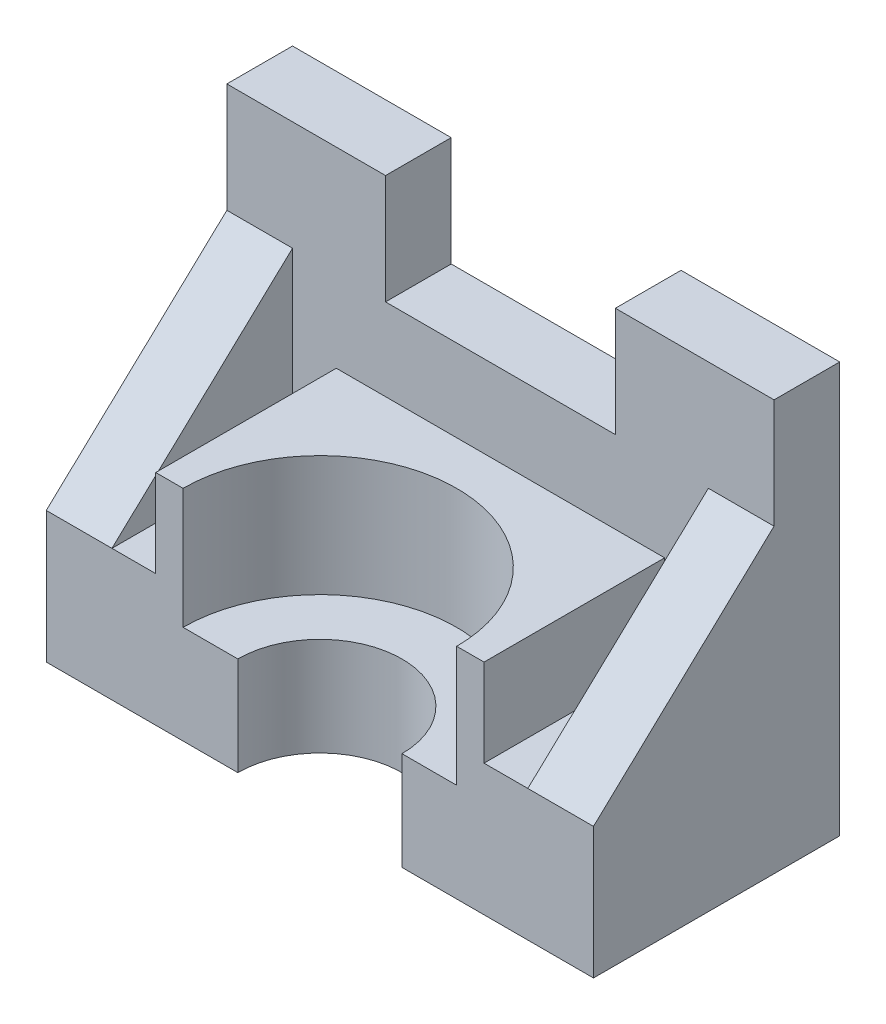
ISO-10303-21;
HEADER;
FILE_DESCRIPTION(('STEP AP214'),'2;1');
FILE_NAME('part.step','',(''),(''),'','','');
FILE_SCHEMA(('AUTOMOTIVE_DESIGN { 1 0 10303 214 1 1 1 1 }'));
ENDSEC;
DATA;
#1=APPLICATION_CONTEXT('core data for automotive mechanical design processes');
#2=APPLICATION_PROTOCOL_DEFINITION('international standard','automotive_design',2000,#1);
#3=PRODUCT_CONTEXT('',#1,'mechanical');
#4=PRODUCT('Part','Part','',(#3));
#5=PRODUCT_RELATED_PRODUCT_CATEGORY('part','',(#4));
#6=PRODUCT_DEFINITION_FORMATION('','',#4);
#7=PRODUCT_DEFINITION_CONTEXT('part definition',#1,'design');
#8=PRODUCT_DEFINITION('design','',#6,#7);
#9=PRODUCT_DEFINITION_SHAPE('','',#8);
#10=(LENGTH_UNIT() NAMED_UNIT(*) SI_UNIT(.MILLI.,.METRE.));
#11=(NAMED_UNIT(*) PLANE_ANGLE_UNIT() SI_UNIT($,.RADIAN.));
#12=(NAMED_UNIT(*) SI_UNIT($,.STERADIAN.) SOLID_ANGLE_UNIT());
#13=UNCERTAINTY_MEASURE_WITH_UNIT(LENGTH_MEASURE(1.E-05),#10,'distance_accuracy_value','');
#14=(GEOMETRIC_REPRESENTATION_CONTEXT(3) GLOBAL_UNCERTAINTY_ASSIGNED_CONTEXT((#13)) GLOBAL_UNIT_ASSIGNED_CONTEXT((#10,
#11,#12)) REPRESENTATION_CONTEXT('',''));
#15=CARTESIAN_POINT('',(0.,0.,0.));
#16=DIRECTION('',(0.,0.,1.));
#17=DIRECTION('',(1.,0.,0.));
#18=AXIS2_PLACEMENT_3D('',#15,#16,#17);
#19=CARTESIAN_POINT('',(-10.8299857607432,18.,17.4203030661037));
#20=DIRECTION('',(0.,-1.,0.));
#21=DIRECTION('',(0.,0.,-1.));
#22=AXIS2_PLACEMENT_3D('',#19,#20,#21);
#23=CYLINDRICAL_SURFACE('',#22,15.);
#24=CARTESIAN_POINT('',(-10.8299857607432,0.,17.4203030661037));
#25=DIRECTION('',(0.,1.,0.));
#26=DIRECTION('',(0.,0.,1.));
#27=AXIS2_PLACEMENT_3D('',#24,#25,#26);
#28=CIRCLE('',#27,15.);
#29=CARTESIAN_POINT('',(4.17001423925681,0.,17.4203030661037));
#30=VERTEX_POINT('',#29);
#31=CARTESIAN_POINT('',(-25.8299857607432,0.,17.4203030661037));
#32=VERTEX_POINT('',#31);
#33=EDGE_CURVE('E112',#30,#32,#28,.T.);
#34=ORIENTED_EDGE('',*,*,#33,.F.);
#35=DIRECTION('',(0.,-1.,0.));
#36=VECTOR('',#35,1.);
#37=CARTESIAN_POINT('',(4.17001423925681,18.,17.4203030661037));
#38=LINE('',#37,#36);
#39=CARTESIAN_POINT('',(4.17001423925681,18.,17.4203030661037));
#40=VERTEX_POINT('',#39);
#41=EDGE_CURVE('E11',#40,#30,#38,.T.);
#42=ORIENTED_EDGE('',*,*,#41,.F.);
#43=CARTESIAN_POINT('',(-10.8299857607432,18.,17.4203030661037));
#44=DIRECTION('',(0.,1.,0.));
#45=DIRECTION('',(0.,0.,1.));
#46=AXIS2_PLACEMENT_3D('',#43,#44,#45);
#47=CIRCLE('',#46,15.);
#48=CARTESIAN_POINT('',(-25.8299857607432,18.,17.4203030661037));
#49=VERTEX_POINT('',#48);
#50=EDGE_CURVE('E92',#40,#49,#47,.T.);
#51=ORIENTED_EDGE('',*,*,#50,.T.);
#52=DIRECTION('',(0.,-1.,0.));
#53=VECTOR('',#52,1.);
#54=CARTESIAN_POINT('',(-25.8299857607432,18.,17.4203030661037));
#55=LINE('',#54,#53);
#56=EDGE_CURVE('E50',#49,#32,#55,.T.);
#57=ORIENTED_EDGE('',*,*,#56,.T.);
#58=EDGE_LOOP('',(#34,#42,#51,#57));
#59=FACE_BOUND('',#58,.T.);
#60=ADVANCED_FACE('F41',(#59),#23,.F.);
#61=CARTESIAN_POINT('',(0.,18.,17.4203030661037));
#62=DIRECTION('',(0.,0.,-1.));
#63=DIRECTION('',(-1.,0.,0.));
#64=AXIS2_PLACEMENT_3D('',#61,#62,#63);
#65=PLANE('',#64);
#66=DIRECTION('',(1.,0.,0.));
#67=VECTOR('',#66,1.);
#68=CARTESIAN_POINT('',(0.,0.,17.4203030661037));
#69=LINE('',#68,#67);
#70=CARTESIAN_POINT('',(39.1700142392568,0.,17.4203030661037));
#71=VERTEX_POINT('',#70);
#72=EDGE_CURVE('E118',#30,#71,#69,.T.);
#73=ORIENTED_EDGE('',*,*,#72,.T.);
#74=DIRECTION('',(0.,-1.,0.));
#75=VECTOR('',#74,1.);
#76=CARTESIAN_POINT('',(39.1700142392568,55.,17.4203030661037));
#77=LINE('',#76,#75);
#78=CARTESIAN_POINT('',(39.1700142392568,24.,17.4203030661037));
#79=VERTEX_POINT('',#78);
#80=EDGE_CURVE('E158',#79,#71,#77,.T.);
#81=ORIENTED_EDGE('',*,*,#80,.F.);
#82=DIRECTION('',(-1.,0.,0.));
#83=VECTOR('',#82,1.);
#84=CARTESIAN_POINT('',(939.170014239257,24.,17.4203030661037));
#85=LINE('',#84,#83);
#86=CARTESIAN_POINT('',(27.1700142392568,24.,17.4203030661037));
#87=VERTEX_POINT('',#86);
#88=EDGE_CURVE('E416',#79,#87,#85,.T.);
#89=ORIENTED_EDGE('',*,*,#88,.T.);
#90=DIRECTION('',(1.,0.,0.));
#91=VECTOR('',#90,1.);
#92=CARTESIAN_POINT('',(0.,24.,17.4203030661037));
#93=LINE('',#92,#91);
#94=CARTESIAN_POINT('',(19.1700142392568,24.,17.4203030661037));
#95=VERTEX_POINT('',#94);
#96=EDGE_CURVE('E178',#95,#87,#93,.T.);
#97=ORIENTED_EDGE('',*,*,#96,.F.);
#98=DIRECTION('',(0.,-1.,0.));
#99=VECTOR('',#98,1.);
#100=CARTESIAN_POINT('',(19.1700142392568,40.,17.4203030661037));
#101=LINE('',#100,#99);
#102=CARTESIAN_POINT('',(19.1700142392568,40.,17.4203030661037));
#103=VERTEX_POINT('',#102);
#104=EDGE_CURVE('E113',#103,#95,#101,.T.);
#105=ORIENTED_EDGE('',*,*,#104,.F.);
#106=DIRECTION('',(1.,0.,0.));
#107=VECTOR('',#106,1.);
#108=CARTESIAN_POINT('',(0.,40.,17.4203030661037));
#109=LINE('',#108,#107);
#110=CARTESIAN_POINT('',(14.1700142392568,40.,17.4203030661037));
#111=VERTEX_POINT('',#110);
#112=EDGE_CURVE('E110',#111,#103,#109,.T.);
#113=ORIENTED_EDGE('',*,*,#112,.F.);
#114=DIRECTION('',(0.,-1.,0.));
#115=VECTOR('',#114,1.);
#116=CARTESIAN_POINT('',(14.1700142392568,40.,17.4203030661037));
#117=LINE('',#116,#115);
#118=CARTESIAN_POINT('',(14.1700142392568,18.,17.4203030661037));
#119=VERTEX_POINT('',#118);
#120=EDGE_CURVE('E102',#111,#119,#117,.T.);
#121=ORIENTED_EDGE('',*,*,#120,.T.);
#122=DIRECTION('',(1.,0.,0.));
#123=VECTOR('',#122,1.);
#124=CARTESIAN_POINT('',(0.,18.,17.4203030661037));
#125=LINE('',#124,#123);
#126=EDGE_CURVE('E87',#40,#119,#125,.T.);
#127=ORIENTED_EDGE('',*,*,#126,.F.);
#128=ORIENTED_EDGE('',*,*,#41,.T.);
#129=EDGE_LOOP('',(#73,#81,#89,#97,#105,#113,#121,#127,#128));
#130=FACE_BOUND('',#129,.T.);
#131=ADVANCED_FACE('F107',(#130),#65,.F.);
#132=CARTESIAN_POINT('',(0.,18.,17.4203030661037));
#133=DIRECTION('',(0.,0.,-1.));
#134=DIRECTION('',(-1.,0.,0.));
#135=AXIS2_PLACEMENT_3D('',#132,#133,#134);
#136=PLANE('',#135);
#137=DIRECTION('',(1.,0.,0.));
#138=VECTOR('',#137,1.);
#139=CARTESIAN_POINT('',(0.,0.,17.4203030661037));
#140=LINE('',#139,#138);
#141=CARTESIAN_POINT('',(-60.8299857607432,0.,17.4203030661037));
#142=VERTEX_POINT('',#141);
#143=EDGE_CURVE('E126',#142,#32,#140,.T.);
#144=ORIENTED_EDGE('',*,*,#143,.T.);
#145=ORIENTED_EDGE('',*,*,#56,.F.);
#146=DIRECTION('',(1.,0.,0.));
#147=VECTOR('',#146,1.);
#148=CARTESIAN_POINT('',(0.,18.,17.4203030661037));
#149=LINE('',#148,#147);
#150=CARTESIAN_POINT('',(-35.8299857607432,18.,17.4203030661037));
#151=VERTEX_POINT('',#150);
#152=EDGE_CURVE('E58',#151,#49,#149,.T.);
#153=ORIENTED_EDGE('',*,*,#152,.F.);
#154=DIRECTION('',(0.,-1.,0.));
#155=VECTOR('',#154,1.);
#156=CARTESIAN_POINT('',(-35.8299857607432,40.,17.4203030661037));
#157=LINE('',#156,#155);
#158=CARTESIAN_POINT('',(-35.8299857607432,40.,17.4203030661037));
#159=VERTEX_POINT('',#158);
#160=EDGE_CURVE('E104',#159,#151,#157,.T.);
#161=ORIENTED_EDGE('',*,*,#160,.F.);
#162=DIRECTION('',(1.,0.,0.));
#163=VECTOR('',#162,1.);
#164=CARTESIAN_POINT('',(0.,40.,17.4203030661037));
#165=LINE('',#164,#163);
#166=CARTESIAN_POINT('',(-40.8299857607432,40.,17.4203030661037));
#167=VERTEX_POINT('',#166);
#168=EDGE_CURVE('E79',#167,#159,#165,.T.);
#169=ORIENTED_EDGE('',*,*,#168,.F.);
#170=DIRECTION('',(0.,-1.,0.));
#171=VECTOR('',#170,1.);
#172=CARTESIAN_POINT('',(-40.8299857607432,40.,17.4203030661037));
#173=LINE('',#172,#171);
#174=CARTESIAN_POINT('',(-40.8299857607432,24.,17.4203030661037));
#175=VERTEX_POINT('',#174);
#176=EDGE_CURVE('E308',#167,#175,#173,.T.);
#177=ORIENTED_EDGE('',*,*,#176,.T.);
#178=DIRECTION('',(1.,0.,0.));
#179=VECTOR('',#178,1.);
#180=CARTESIAN_POINT('',(0.,24.,17.4203030661037));
#181=LINE('',#180,#179);
#182=CARTESIAN_POINT('',(-48.8299857607432,24.,17.4203030661037));
#183=VERTEX_POINT('',#182);
#184=EDGE_CURVE('E271',#183,#175,#181,.T.);
#185=ORIENTED_EDGE('',*,*,#184,.F.);
#186=DIRECTION('',(-1.,0.,0.));
#187=VECTOR('',#186,1.);
#188=CARTESIAN_POINT('',(939.170014239257,24.,17.4203030661037));
#189=LINE('',#188,#187);
#190=CARTESIAN_POINT('',(-60.8299857607432,24.,17.4203030661037));
#191=VERTEX_POINT('',#190);
#192=EDGE_CURVE('E251',#183,#191,#189,.T.);
#193=ORIENTED_EDGE('',*,*,#192,.T.);
#194=DIRECTION('',(0.,-1.,0.));
#195=VECTOR('',#194,1.);
#196=CARTESIAN_POINT('',(-60.8299857607432,55.,17.4203030661037));
#197=LINE('',#196,#195);
#198=EDGE_CURVE('E144',#191,#142,#197,.T.);
#199=ORIENTED_EDGE('',*,*,#198,.T.);
#200=EDGE_LOOP('',(#144,#145,#153,#161,#169,#177,#185,#193,#199));
#201=FACE_BOUND('',#200,.T.);
#202=ADVANCED_FACE('F140',(#201),#136,.F.);
#203=CARTESIAN_POINT('',(0.,18.,0.));
#204=DIRECTION('',(0.,1.,0.));
#205=DIRECTION('',(0.,0.,1.));
#206=AXIS2_PLACEMENT_3D('',#203,#204,#205);
#207=PLANE('',#206);
#208=ORIENTED_EDGE('',*,*,#50,.F.);
#209=ORIENTED_EDGE('',*,*,#126,.T.);
#210=CARTESIAN_POINT('',(-10.8299857607432,18.,17.4203030661037));
#211=DIRECTION('',(0.,1.,0.));
#212=DIRECTION('',(0.,0.,1.));
#213=AXIS2_PLACEMENT_3D('',#210,#211,#212);
#214=CIRCLE('',#213,25.);
#215=EDGE_CURVE('E90',#119,#151,#214,.T.);
#216=ORIENTED_EDGE('',*,*,#215,.T.);
#217=ORIENTED_EDGE('',*,*,#152,.T.);
#218=EDGE_LOOP('',(#208,#209,#216,#217));
#219=FACE_BOUND('',#218,.T.);
#220=ADVANCED_FACE('F89',(#219),#207,.T.);
#221=CARTESIAN_POINT('',(0.,0.,0.));
#222=DIRECTION('',(0.,1.,0.));
#223=DIRECTION('',(0.,0.,1.));
#224=AXIS2_PLACEMENT_3D('',#221,#222,#223);
#225=PLANE('',#224);
#226=ORIENTED_EDGE('',*,*,#33,.T.);
#227=ORIENTED_EDGE('',*,*,#143,.F.);
#228=DIRECTION('',(0.,0.,1.));
#229=VECTOR('',#228,1.);
#230=CARTESIAN_POINT('',(-60.8299857607432,0.,0.));
#231=LINE('',#230,#229);
#232=CARTESIAN_POINT('',(-60.8299857607432,0.,-27.5796969338963));
#233=VERTEX_POINT('',#232);
#234=EDGE_CURVE('E258',#233,#142,#231,.T.);
#235=ORIENTED_EDGE('',*,*,#234,.F.);
#236=DIRECTION('',(1.,0.,0.));
#237=VECTOR('',#236,1.);
#238=CARTESIAN_POINT('',(0.,0.,-27.5796969338963));
#239=LINE('',#238,#237);
#240=CARTESIAN_POINT('',(39.1700142392568,0.,-27.5796969338963));
#241=VERTEX_POINT('',#240);
#242=EDGE_CURVE('E212',#233,#241,#239,.T.);
#243=ORIENTED_EDGE('',*,*,#242,.T.);
#244=DIRECTION('',(0.,0.,1.));
#245=VECTOR('',#244,1.);
#246=CARTESIAN_POINT('',(39.1700142392568,0.,0.));
#247=LINE('',#246,#245);
#248=EDGE_CURVE('E153',#241,#71,#247,.T.);
#249=ORIENTED_EDGE('',*,*,#248,.T.);
#250=ORIENTED_EDGE('',*,*,#72,.F.);
#251=EDGE_LOOP('',(#226,#227,#235,#243,#249,#250));
#252=FACE_BOUND('',#251,.T.);
#253=ADVANCED_FACE('F148',(#252),#225,.F.);
#254=CARTESIAN_POINT('',(-10.8299857607432,40.,17.4203030661037));
#255=DIRECTION('',(0.,-1.,0.));
#256=DIRECTION('',(0.,0.,-1.));
#257=AXIS2_PLACEMENT_3D('',#254,#255,#256);
#258=CYLINDRICAL_SURFACE('',#257,25.);
#259=ORIENTED_EDGE('',*,*,#160,.T.);
#260=ORIENTED_EDGE('',*,*,#215,.F.);
#261=ORIENTED_EDGE('',*,*,#120,.F.);
#262=CARTESIAN_POINT('',(-10.8299857607432,40.,17.4203030661037));
#263=DIRECTION('',(0.,1.,0.));
#264=DIRECTION('',(0.,0.,1.));
#265=AXIS2_PLACEMENT_3D('',#262,#263,#264);
#266=CIRCLE('',#265,25.);
#267=EDGE_CURVE('E287',#111,#159,#266,.T.);
#268=ORIENTED_EDGE('',*,*,#267,.T.);
#269=EDGE_LOOP('',(#259,#260,#261,#268));
#270=FACE_BOUND('',#269,.T.);
#271=ADVANCED_FACE('F99',(#270),#258,.F.);
#272=CARTESIAN_POINT('',(19.1700142392568,40.,0.));
#273=DIRECTION('',(-1.,0.,0.));
#274=DIRECTION('',(0.,0.,1.));
#275=AXIS2_PLACEMENT_3D('',#272,#273,#274);
#276=PLANE('',#275);
#277=ORIENTED_EDGE('',*,*,#104,.T.);
#278=DIRECTION('',(0.,0.,-1.));
#279=VECTOR('',#278,1.);
#280=CARTESIAN_POINT('',(19.1700142392568,24.,0.));
#281=LINE('',#280,#279);
#282=CARTESIAN_POINT('',(19.1700142392568,24.,-15.5796969338963));
#283=VERTEX_POINT('',#282);
#284=EDGE_CURVE('E172',#95,#283,#281,.T.);
#285=ORIENTED_EDGE('',*,*,#284,.T.);
#286=DIRECTION('',(0.,-1.,0.));
#287=VECTOR('',#286,1.);
#288=CARTESIAN_POINT('',(19.1700142392568,40.,-15.5796969338963));
#289=LINE('',#288,#287);
#290=CARTESIAN_POINT('',(19.1700142392568,40.,-15.5796969338963));
#291=VERTEX_POINT('',#290);
#292=EDGE_CURVE('E121',#291,#283,#289,.T.);
#293=ORIENTED_EDGE('',*,*,#292,.F.);
#294=DIRECTION('',(0.,0.,-1.));
#295=VECTOR('',#294,1.);
#296=CARTESIAN_POINT('',(19.1700142392568,40.,0.));
#297=LINE('',#296,#295);
#298=EDGE_CURVE('E292',#103,#291,#297,.T.);
#299=ORIENTED_EDGE('',*,*,#298,.F.);
#300=EDGE_LOOP('',(#277,#285,#293,#299));
#301=FACE_BOUND('',#300,.T.);
#302=ADVANCED_FACE('F335',(#301),#276,.F.);
#303=CARTESIAN_POINT('',(-40.8299857607432,40.,0.));
#304=DIRECTION('',(-1.,0.,0.));
#305=DIRECTION('',(0.,0.,1.));
#306=AXIS2_PLACEMENT_3D('',#303,#304,#305);
#307=PLANE('',#306);
#308=DIRECTION('',(0.,0.,-1.));
#309=VECTOR('',#308,1.);
#310=CARTESIAN_POINT('',(-40.8299857607432,24.,0.));
#311=LINE('',#310,#309);
#312=CARTESIAN_POINT('',(-40.8299857607432,24.,-15.5796969338963));
#313=VERTEX_POINT('',#312);
#314=EDGE_CURVE('E275',#175,#313,#311,.T.);
#315=ORIENTED_EDGE('',*,*,#314,.F.);
#316=ORIENTED_EDGE('',*,*,#176,.F.);
#317=DIRECTION('',(0.,0.,-1.));
#318=VECTOR('',#317,1.);
#319=CARTESIAN_POINT('',(-40.8299857607432,40.,0.));
#320=LINE('',#319,#318);
#321=CARTESIAN_POINT('',(-40.8299857607432,40.,-15.5796969338963));
#322=VERTEX_POINT('',#321);
#323=EDGE_CURVE('E300',#167,#322,#320,.T.);
#324=ORIENTED_EDGE('',*,*,#323,.T.);
#325=DIRECTION('',(0.,-1.,0.));
#326=VECTOR('',#325,1.);
#327=CARTESIAN_POINT('',(-40.8299857607432,40.,-15.5796969338963));
#328=LINE('',#327,#326);
#329=EDGE_CURVE('E312',#322,#313,#328,.T.);
#330=ORIENTED_EDGE('',*,*,#329,.T.);
#331=EDGE_LOOP('',(#315,#316,#324,#330));
#332=FACE_BOUND('',#331,.T.);
#333=ADVANCED_FACE('F487',(#332),#307,.T.);
#334=CARTESIAN_POINT('',(0.,40.,0.));
#335=DIRECTION('',(0.,1.,0.));
#336=DIRECTION('',(0.,0.,1.));
#337=AXIS2_PLACEMENT_3D('',#334,#335,#336);
#338=PLANE('',#337);
#339=ORIENTED_EDGE('',*,*,#267,.F.);
#340=ORIENTED_EDGE('',*,*,#112,.T.);
#341=ORIENTED_EDGE('',*,*,#298,.T.);
#342=DIRECTION('',(-1.,0.,0.));
#343=VECTOR('',#342,1.);
#344=CARTESIAN_POINT('',(0.,40.,-15.5796969338963));
#345=LINE('',#344,#343);
#346=EDGE_CURVE('E296',#291,#322,#345,.T.);
#347=ORIENTED_EDGE('',*,*,#346,.T.);
#348=ORIENTED_EDGE('',*,*,#323,.F.);
#349=ORIENTED_EDGE('',*,*,#168,.T.);
#350=EDGE_LOOP('',(#339,#340,#341,#347,#348,#349));
#351=FACE_BOUND('',#350,.T.);
#352=ADVANCED_FACE('F490',(#351),#338,.T.);
#353=CARTESIAN_POINT('',(0.,75.,-15.5796969338963));
#354=DIRECTION('',(0.,0.,1.));
#355=DIRECTION('',(1.,0.,0.));
#356=AXIS2_PLACEMENT_3D('',#353,#354,#355);
#357=PLANE('',#356);
#358=ORIENTED_EDGE('',*,*,#292,.T.);
#359=DIRECTION('',(-1.,0.,0.));
#360=VECTOR('',#359,1.);
#361=CARTESIAN_POINT('',(0.,24.,-15.5796969338963));
#362=LINE('',#361,#360);
#363=CARTESIAN_POINT('',(27.1700142392568,24.,-15.5796969338963));
#364=VERTEX_POINT('',#363);
#365=EDGE_CURVE('E192',#364,#283,#362,.T.);
#366=ORIENTED_EDGE('',*,*,#365,.F.);
#367=DIRECTION('',(0.,-1.,0.));
#368=VECTOR('',#367,1.);
#369=CARTESIAN_POINT('',(27.1700142392568,55.,-15.5796969338963));
#370=LINE('',#369,#368);
#371=CARTESIAN_POINT('',(27.1700142392568,55.,-15.5796969338963));
#372=VERTEX_POINT('',#371);
#373=EDGE_CURVE('E173',#372,#364,#370,.T.);
#374=ORIENTED_EDGE('',*,*,#373,.F.);
#375=DIRECTION('',(-1.,0.,0.));
#376=VECTOR('',#375,1.);
#377=CARTESIAN_POINT('',(0.,55.,-15.5796969338963));
#378=LINE('',#377,#376);
#379=CARTESIAN_POINT('',(39.1700142392568,55.,-15.5796969338963));
#380=VERTEX_POINT('',#379);
#381=EDGE_CURVE('E181',#380,#372,#378,.T.);
#382=ORIENTED_EDGE('',*,*,#381,.F.);
#383=DIRECTION('',(0.,-1.,0.));
#384=VECTOR('',#383,1.);
#385=CARTESIAN_POINT('',(39.1700142392568,75.,-15.5796969338963));
#386=LINE('',#385,#384);
#387=CARTESIAN_POINT('',(39.1700142392568,75.,-15.5796969338963));
#388=VERTEX_POINT('',#387);
#389=EDGE_CURVE('E442',#388,#380,#386,.T.);
#390=ORIENTED_EDGE('',*,*,#389,.F.);
#391=DIRECTION('',(-1.,0.,0.));
#392=VECTOR('',#391,1.);
#393=CARTESIAN_POINT('',(0.,75.,-15.5796969338963));
#394=LINE('',#393,#392);
#395=CARTESIAN_POINT('',(10.1700142392568,75.,-15.5796969338963));
#396=VERTEX_POINT('',#395);
#397=EDGE_CURVE('E427',#388,#396,#394,.T.);
#398=ORIENTED_EDGE('',*,*,#397,.T.);
#399=DIRECTION('',(0.,-1.,0.));
#400=VECTOR('',#399,1.);
#401=CARTESIAN_POINT('',(10.1700142392568,75.,-15.5796969338963));
#402=LINE('',#401,#400);
#403=CARTESIAN_POINT('',(10.1700142392568,55.,-15.5796969338963));
#404=VERTEX_POINT('',#403);
#405=EDGE_CURVE('E417',#396,#404,#402,.T.);
#406=ORIENTED_EDGE('',*,*,#405,.T.);
#407=DIRECTION('',(-1.,0.,0.));
#408=VECTOR('',#407,1.);
#409=CARTESIAN_POINT('',(0.,55.,-15.5796969338963));
#410=LINE('',#409,#408);
#411=CARTESIAN_POINT('',(-31.8299857607432,55.,-15.5796969338963));
#412=VERTEX_POINT('',#411);
#413=EDGE_CURVE('E208',#404,#412,#410,.T.);
#414=ORIENTED_EDGE('',*,*,#413,.T.);
#415=DIRECTION('',(0.,-1.,0.));
#416=VECTOR('',#415,1.);
#417=CARTESIAN_POINT('',(-31.8299857607432,75.,-15.5796969338963));
#418=LINE('',#417,#416);
#419=CARTESIAN_POINT('',(-31.8299857607432,75.,-15.5796969338963));
#420=VERTEX_POINT('',#419);
#421=EDGE_CURVE('E243',#420,#412,#418,.T.);
#422=ORIENTED_EDGE('',*,*,#421,.F.);
#423=DIRECTION('',(-1.,0.,0.));
#424=VECTOR('',#423,1.);
#425=CARTESIAN_POINT('',(0.,75.,-15.5796969338963));
#426=LINE('',#425,#424);
#427=CARTESIAN_POINT('',(-60.8299857607432,75.,-15.5796969338963));
#428=VERTEX_POINT('',#427);
#429=EDGE_CURVE('E213',#420,#428,#426,.T.);
#430=ORIENTED_EDGE('',*,*,#429,.T.);
#431=DIRECTION('',(0.,-1.,0.));
#432=VECTOR('',#431,1.);
#433=CARTESIAN_POINT('',(-60.8299857607432,75.,-15.5796969338963));
#434=LINE('',#433,#432);
#435=CARTESIAN_POINT('',(-60.8299857607432,55.,-15.5796969338963));
#436=VERTEX_POINT('',#435);
#437=EDGE_CURVE('E229',#428,#436,#434,.T.);
#438=ORIENTED_EDGE('',*,*,#437,.T.);
#439=DIRECTION('',(-1.,0.,0.));
#440=VECTOR('',#439,1.);
#441=CARTESIAN_POINT('',(0.,55.,-15.5796969338963));
#442=LINE('',#441,#440);
#443=CARTESIAN_POINT('',(-48.8299857607432,55.,-15.5796969338963));
#444=VERTEX_POINT('',#443);
#445=EDGE_CURVE('E259',#444,#436,#442,.T.);
#446=ORIENTED_EDGE('',*,*,#445,.F.);
#447=DIRECTION('',(0.,-1.,0.));
#448=VECTOR('',#447,1.);
#449=CARTESIAN_POINT('',(-48.8299857607432,55.,-15.5796969338963));
#450=LINE('',#449,#448);
#451=CARTESIAN_POINT('',(-48.8299857607432,24.,-15.5796969338963));
#452=VERTEX_POINT('',#451);
#453=EDGE_CURVE('E267',#444,#452,#450,.T.);
#454=ORIENTED_EDGE('',*,*,#453,.T.);
#455=DIRECTION('',(-1.,0.,0.));
#456=VECTOR('',#455,1.);
#457=CARTESIAN_POINT('',(0.,24.,-15.5796969338963));
#458=LINE('',#457,#456);
#459=EDGE_CURVE('E279',#313,#452,#458,.T.);
#460=ORIENTED_EDGE('',*,*,#459,.F.);
#461=ORIENTED_EDGE('',*,*,#329,.F.);
#462=ORIENTED_EDGE('',*,*,#346,.F.);
#463=EDGE_LOOP('',(#358,#366,#374,#382,#390,#398,#406,#414,#422,#430,#438,#446,#454,#460,#461,#462));
#464=FACE_BOUND('',#463,.T.);
#465=ADVANCED_FACE('F322',(#464),#357,.T.);
#466=CARTESIAN_POINT('',(0.,24.,0.));
#467=DIRECTION('',(0.,1.,0.));
#468=DIRECTION('',(0.,0.,1.));
#469=AXIS2_PLACEMENT_3D('',#466,#467,#468);
#470=PLANE('',#469);
#471=ORIENTED_EDGE('',*,*,#184,.T.);
#472=ORIENTED_EDGE('',*,*,#314,.T.);
#473=ORIENTED_EDGE('',*,*,#459,.T.);
#474=DIRECTION('',(0.,0.,-1.));
#475=VECTOR('',#474,1.);
#476=CARTESIAN_POINT('',(-48.8299857607432,24.,0.));
#477=LINE('',#476,#475);
#478=EDGE_CURVE('E283',#183,#452,#477,.T.);
#479=ORIENTED_EDGE('',*,*,#478,.F.);
#480=EDGE_LOOP('',(#471,#472,#473,#479));
#481=FACE_BOUND('',#480,.T.);
#482=ADVANCED_FACE('F494',(#481),#470,.T.);
#483=CARTESIAN_POINT('',(-48.8299857607432,55.,0.));
#484=DIRECTION('',(-1.,0.,0.));
#485=DIRECTION('',(0.,0.,1.));
#486=AXIS2_PLACEMENT_3D('',#483,#484,#485);
#487=PLANE('',#486);
#488=ORIENTED_EDGE('',*,*,#453,.F.);
#489=DIRECTION('',(0.,-0.684675461664049,0.728848072093987));
#490=VECTOR('',#489,1.);
#491=CARTESIAN_POINT('',(-48.8299857607432,47.2253512373776,-7.30345792852405));
#492=LINE('',#491,#490);
#493=EDGE_CURVE('E254',#444,#183,#492,.T.);
#494=ORIENTED_EDGE('',*,*,#493,.T.);
#495=ORIENTED_EDGE('',*,*,#478,.T.);
#496=EDGE_LOOP('',(#488,#494,#495));
#497=FACE_BOUND('',#496,.T.);
#498=ADVANCED_FACE('F497',(#497),#487,.F.);
#499=CARTESIAN_POINT('',(-60.8299857607432,55.,0.));
#500=DIRECTION('',(1.,0.,0.));
#501=DIRECTION('',(0.,0.,-1.));
#502=AXIS2_PLACEMENT_3D('',#499,#500,#501);
#503=PLANE('',#502);
#504=ORIENTED_EDGE('',*,*,#198,.F.);
#505=DIRECTION('',(0.,-0.684675461664049,0.728848072093987));
#506=VECTOR('',#505,1.);
#507=CARTESIAN_POINT('',(-60.8299857607432,24.,17.4203030661037));
#508=LINE('',#507,#506);
#509=EDGE_CURVE('E247',#436,#191,#508,.T.);
#510=ORIENTED_EDGE('',*,*,#509,.F.);
#511=ORIENTED_EDGE('',*,*,#437,.F.);
#512=DIRECTION('',(0.,0.,1.));
#513=VECTOR('',#512,1.);
#514=CARTESIAN_POINT('',(-60.8299857607432,75.,0.));
#515=LINE('',#514,#513);
#516=CARTESIAN_POINT('',(-60.8299857607432,75.,-27.5796969338963));
#517=VERTEX_POINT('',#516);
#518=EDGE_CURVE('E225',#517,#428,#515,.T.);
#519=ORIENTED_EDGE('',*,*,#518,.F.);
#520=DIRECTION('',(0.,-1.,0.));
#521=VECTOR('',#520,1.);
#522=CARTESIAN_POINT('',(-60.8299857607432,75.,-27.5796969338963));
#523=LINE('',#522,#521);
#524=EDGE_CURVE('E235',#517,#233,#523,.T.);
#525=ORIENTED_EDGE('',*,*,#524,.T.);
#526=ORIENTED_EDGE('',*,*,#234,.T.);
#527=EDGE_LOOP('',(#504,#510,#511,#519,#525,#526));
#528=FACE_BOUND('',#527,.T.);
#529=ADVANCED_FACE('F501',(#528),#503,.F.);
#530=CARTESIAN_POINT('',(939.170014239257,24.,17.4203030661037));
#531=DIRECTION('',(0.,-0.728848072093987,-0.684675461664049));
#532=DIRECTION('',(0.,0.684675461664049,-0.728848072093987));
#533=AXIS2_PLACEMENT_3D('',#530,#531,#532);
#534=PLANE('',#533);
#535=ORIENTED_EDGE('',*,*,#445,.T.);
#536=ORIENTED_EDGE('',*,*,#509,.T.);
#537=ORIENTED_EDGE('',*,*,#192,.F.);
#538=ORIENTED_EDGE('',*,*,#493,.F.);
#539=EDGE_LOOP('',(#535,#536,#537,#538));
#540=FACE_BOUND('',#539,.T.);
#541=ADVANCED_FACE('F505',(#540),#534,.F.);
#542=CARTESIAN_POINT('',(-31.8299857607432,75.,0.));
#543=DIRECTION('',(-1.,0.,0.));
#544=DIRECTION('',(0.,0.,1.));
#545=AXIS2_PLACEMENT_3D('',#542,#543,#544);
#546=PLANE('',#545);
#547=ORIENTED_EDGE('',*,*,#421,.T.);
#548=DIRECTION('',(0.,0.,-1.));
#549=VECTOR('',#548,1.);
#550=CARTESIAN_POINT('',(-31.8299857607432,55.,0.));
#551=LINE('',#550,#549);
#552=CARTESIAN_POINT('',(-31.8299857607432,55.,-27.5796969338963));
#553=VERTEX_POINT('',#552);
#554=EDGE_CURVE('E204',#412,#553,#551,.T.);
#555=ORIENTED_EDGE('',*,*,#554,.T.);
#556=DIRECTION('',(0.,-1.,0.));
#557=VECTOR('',#556,1.);
#558=CARTESIAN_POINT('',(-31.8299857607432,75.,-27.5796969338963));
#559=LINE('',#558,#557);
#560=CARTESIAN_POINT('',(-31.8299857607432,75.,-27.5796969338963));
#561=VERTEX_POINT('',#560);
#562=EDGE_CURVE('E239',#561,#553,#559,.T.);
#563=ORIENTED_EDGE('',*,*,#562,.F.);
#564=DIRECTION('',(0.,0.,-1.));
#565=VECTOR('',#564,1.);
#566=CARTESIAN_POINT('',(-31.8299857607432,75.,0.));
#567=LINE('',#566,#565);
#568=EDGE_CURVE('E217',#420,#561,#567,.T.);
#569=ORIENTED_EDGE('',*,*,#568,.F.);
#570=EDGE_LOOP('',(#547,#555,#563,#569));
#571=FACE_BOUND('',#570,.T.);
#572=ADVANCED_FACE('F509',(#571),#546,.F.);
#573=CARTESIAN_POINT('',(0.,75.,-27.5796969338963));
#574=DIRECTION('',(0.,0.,-1.));
#575=DIRECTION('',(-1.,0.,0.));
#576=AXIS2_PLACEMENT_3D('',#573,#574,#575);
#577=PLANE('',#576);
#578=ORIENTED_EDGE('',*,*,#242,.F.);
#579=ORIENTED_EDGE('',*,*,#524,.F.);
#580=DIRECTION('',(1.,0.,0.));
#581=VECTOR('',#580,1.);
#582=CARTESIAN_POINT('',(0.,75.,-27.5796969338963));
#583=LINE('',#582,#581);
#584=EDGE_CURVE('E221',#517,#561,#583,.T.);
#585=ORIENTED_EDGE('',*,*,#584,.T.);
#586=ORIENTED_EDGE('',*,*,#562,.T.);
#587=DIRECTION('',(1.,0.,0.));
#588=VECTOR('',#587,1.);
#589=CARTESIAN_POINT('',(0.,55.,-27.5796969338963));
#590=LINE('',#589,#588);
#591=CARTESIAN_POINT('',(10.1700142392568,55.,-27.5796969338963));
#592=VERTEX_POINT('',#591);
#593=EDGE_CURVE('E200',#553,#592,#590,.T.);
#594=ORIENTED_EDGE('',*,*,#593,.T.);
#595=DIRECTION('',(0.,-1.,0.));
#596=VECTOR('',#595,1.);
#597=CARTESIAN_POINT('',(10.1700142392568,75.,-27.5796969338963));
#598=LINE('',#597,#596);
#599=CARTESIAN_POINT('',(10.1700142392568,75.,-27.5796969338963));
#600=VERTEX_POINT('',#599);
#601=EDGE_CURVE('E407',#600,#592,#598,.T.);
#602=ORIENTED_EDGE('',*,*,#601,.F.);
#603=DIRECTION('',(1.,0.,0.));
#604=VECTOR('',#603,1.);
#605=CARTESIAN_POINT('',(0.,75.,-27.5796969338963));
#606=LINE('',#605,#604);
#607=CARTESIAN_POINT('',(39.1700142392568,75.,-27.5796969338963));
#608=VERTEX_POINT('',#607);
#609=EDGE_CURVE('E412',#600,#608,#606,.T.);
#610=ORIENTED_EDGE('',*,*,#609,.T.);
#611=DIRECTION('',(0.,-1.,0.));
#612=VECTOR('',#611,1.);
#613=CARTESIAN_POINT('',(39.1700142392568,75.,-27.5796969338963));
#614=LINE('',#613,#612);
#615=EDGE_CURVE('E439',#608,#241,#614,.T.);
#616=ORIENTED_EDGE('',*,*,#615,.T.);
#617=EDGE_LOOP('',(#578,#579,#585,#586,#594,#602,#610,#616));
#618=FACE_BOUND('',#617,.T.);
#619=ADVANCED_FACE('F410',(#618),#577,.T.);
#620=CARTESIAN_POINT('',(0.,75.,0.));
#621=DIRECTION('',(0.,1.,0.));
#622=DIRECTION('',(0.,0.,1.));
#623=AXIS2_PLACEMENT_3D('',#620,#621,#622);
#624=PLANE('',#623);
#625=ORIENTED_EDGE('',*,*,#429,.F.);
#626=ORIENTED_EDGE('',*,*,#568,.T.);
#627=ORIENTED_EDGE('',*,*,#584,.F.);
#628=ORIENTED_EDGE('',*,*,#518,.T.);
#629=EDGE_LOOP('',(#625,#626,#627,#628));
#630=FACE_BOUND('',#629,.T.);
#631=ADVANCED_FACE('F518',(#630),#624,.T.);
#632=CARTESIAN_POINT('',(0.,55.,0.));
#633=DIRECTION('',(0.,1.,0.));
#634=DIRECTION('',(0.,0.,1.));
#635=AXIS2_PLACEMENT_3D('',#632,#633,#634);
#636=PLANE('',#635);
#637=DIRECTION('',(0.,0.,1.));
#638=VECTOR('',#637,1.);
#639=CARTESIAN_POINT('',(10.1700142392568,55.,0.));
#640=LINE('',#639,#638);
#641=EDGE_CURVE('E196',#592,#404,#640,.T.);
#642=ORIENTED_EDGE('',*,*,#641,.F.);
#643=ORIENTED_EDGE('',*,*,#593,.F.);
#644=ORIENTED_EDGE('',*,*,#554,.F.);
#645=ORIENTED_EDGE('',*,*,#413,.F.);
#646=EDGE_LOOP('',(#642,#643,#644,#645));
#647=FACE_BOUND('',#646,.T.);
#648=ADVANCED_FACE('F521',(#647),#636,.T.);
#649=CARTESIAN_POINT('',(10.1700142392568,75.,0.));
#650=DIRECTION('',(1.,0.,0.));
#651=DIRECTION('',(0.,0.,-1.));
#652=AXIS2_PLACEMENT_3D('',#649,#650,#651);
#653=PLANE('',#652);
#654=ORIENTED_EDGE('',*,*,#601,.T.);
#655=ORIENTED_EDGE('',*,*,#641,.T.);
#656=ORIENTED_EDGE('',*,*,#405,.F.);
#657=DIRECTION('',(0.,0.,1.));
#658=VECTOR('',#657,1.);
#659=CARTESIAN_POINT('',(10.1700142392568,75.,0.));
#660=LINE('',#659,#658);
#661=EDGE_CURVE('E420',#600,#396,#660,.T.);
#662=ORIENTED_EDGE('',*,*,#661,.F.);
#663=EDGE_LOOP('',(#654,#655,#656,#662));
#664=FACE_BOUND('',#663,.T.);
#665=ADVANCED_FACE('F421',(#664),#653,.F.);
#666=CARTESIAN_POINT('',(0.,24.,0.));
#667=DIRECTION('',(0.,1.,0.));
#668=DIRECTION('',(0.,0.,1.));
#669=AXIS2_PLACEMENT_3D('',#666,#667,#668);
#670=PLANE('',#669);
#671=ORIENTED_EDGE('',*,*,#284,.F.);
#672=ORIENTED_EDGE('',*,*,#96,.T.);
#673=DIRECTION('',(0.,0.,-1.));
#674=VECTOR('',#673,1.);
#675=CARTESIAN_POINT('',(27.1700142392568,24.,0.));
#676=LINE('',#675,#674);
#677=EDGE_CURVE('E188',#87,#364,#676,.T.);
#678=ORIENTED_EDGE('',*,*,#677,.T.);
#679=ORIENTED_EDGE('',*,*,#365,.T.);
#680=EDGE_LOOP('',(#671,#672,#678,#679));
#681=FACE_BOUND('',#680,.T.);
#682=ADVANCED_FACE('F333',(#681),#670,.T.);
#683=CARTESIAN_POINT('',(27.1700142392568,55.,0.));
#684=DIRECTION('',(-1.,0.,0.));
#685=DIRECTION('',(0.,0.,1.));
#686=AXIS2_PLACEMENT_3D('',#683,#684,#685);
#687=PLANE('',#686);
#688=DIRECTION('',(0.,-0.684675461664049,0.728848072093987));
#689=VECTOR('',#688,1.);
#690=CARTESIAN_POINT('',(27.1700142392568,47.2253512373776,-7.30345792852405));
#691=LINE('',#690,#689);
#692=EDGE_CURVE('E451',#372,#87,#691,.T.);
#693=ORIENTED_EDGE('',*,*,#692,.F.);
#694=ORIENTED_EDGE('',*,*,#373,.T.);
#695=ORIENTED_EDGE('',*,*,#677,.F.);
#696=EDGE_LOOP('',(#693,#694,#695));
#697=FACE_BOUND('',#696,.T.);
#698=ADVANCED_FACE('F461',(#697),#687,.T.);
#699=CARTESIAN_POINT('',(39.1700142392568,55.,0.));
#700=DIRECTION('',(1.,0.,0.));
#701=DIRECTION('',(0.,0.,-1.));
#702=AXIS2_PLACEMENT_3D('',#699,#700,#701);
#703=PLANE('',#702);
#704=DIRECTION('',(0.,0.684675461664049,-0.728848072093987));
#705=VECTOR('',#704,1.);
#706=CARTESIAN_POINT('',(39.1700142392568,47.2253512373776,-7.30345792852405));
#707=LINE('',#706,#705);
#708=EDGE_CURVE('E170',#79,#380,#707,.T.);
#709=ORIENTED_EDGE('',*,*,#708,.F.);
#710=ORIENTED_EDGE('',*,*,#80,.T.);
#711=ORIENTED_EDGE('',*,*,#248,.F.);
#712=ORIENTED_EDGE('',*,*,#615,.F.);
#713=DIRECTION('',(0.,0.,1.));
#714=VECTOR('',#713,1.);
#715=CARTESIAN_POINT('',(39.1700142392568,75.,0.));
#716=LINE('',#715,#714);
#717=EDGE_CURVE('E431',#608,#388,#716,.T.);
#718=ORIENTED_EDGE('',*,*,#717,.T.);
#719=ORIENTED_EDGE('',*,*,#389,.T.);
#720=EDGE_LOOP('',(#709,#710,#711,#712,#718,#719));
#721=FACE_BOUND('',#720,.T.);
#722=ADVANCED_FACE('F164',(#721),#703,.T.);
#723=CARTESIAN_POINT('',(939.170014239257,24.,17.4203030661037));
#724=DIRECTION('',(0.,-0.728848072093987,-0.684675461664049));
#725=DIRECTION('',(0.,0.684675461664049,-0.728848072093987));
#726=AXIS2_PLACEMENT_3D('',#723,#724,#725);
#727=PLANE('',#726);
#728=ORIENTED_EDGE('',*,*,#692,.T.);
#729=ORIENTED_EDGE('',*,*,#88,.F.);
#730=ORIENTED_EDGE('',*,*,#708,.T.);
#731=ORIENTED_EDGE('',*,*,#381,.T.);
#732=EDGE_LOOP('',(#728,#729,#730,#731));
#733=FACE_BOUND('',#732,.T.);
#734=ADVANCED_FACE('F459',(#733),#727,.F.);
#735=CARTESIAN_POINT('',(0.,75.,0.));
#736=DIRECTION('',(0.,1.,0.));
#737=DIRECTION('',(0.,0.,1.));
#738=AXIS2_PLACEMENT_3D('',#735,#736,#737);
#739=PLANE('',#738);
#740=ORIENTED_EDGE('',*,*,#609,.F.);
#741=ORIENTED_EDGE('',*,*,#661,.T.);
#742=ORIENTED_EDGE('',*,*,#397,.F.);
#743=ORIENTED_EDGE('',*,*,#717,.F.);
#744=EDGE_LOOP('',(#740,#741,#742,#743));
#745=FACE_BOUND('',#744,.T.);
#746=ADVANCED_FACE('F429',(#745),#739,.T.);
#747=CLOSED_SHELL('',(#60,#131,#202,#220,#253,#271,#302,#333,#352,#465,#482,#498,#529,#541,#572,
#619,#631,#648,#665,#682,#698,#722,#734,#746));
#748=MANIFOLD_SOLID_BREP('B2',#747);
#749=ADVANCED_BREP_SHAPE_REPRESENTATION('',(#18,#748),#14);
#750=SHAPE_DEFINITION_REPRESENTATION(#9,#749);
ENDSEC;
END-ISO-10303-21;
